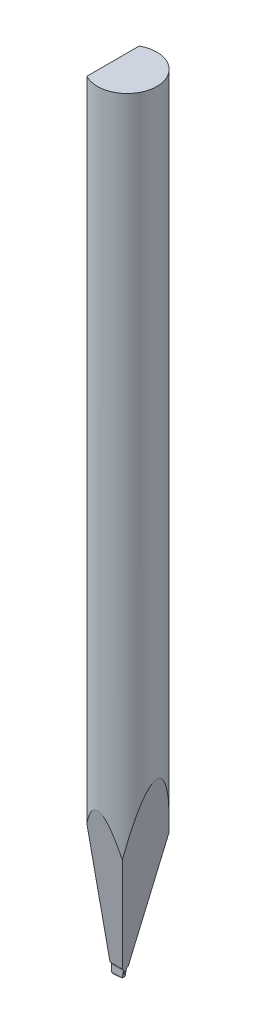
ISO-10303-21;
HEADER;
FILE_DESCRIPTION(('STEP AP214'),'2;1');
FILE_NAME('part.step','',(''),(''),'','','');
FILE_SCHEMA(('AUTOMOTIVE_DESIGN { 1 0 10303 214 1 1 1 1 }'));
ENDSEC;
DATA;
#1=APPLICATION_CONTEXT('core data for automotive mechanical design processes');
#2=APPLICATION_PROTOCOL_DEFINITION('international standard','automotive_design',2000,#1);
#3=PRODUCT_CONTEXT('',#1,'mechanical');
#4=PRODUCT('Part','Part','',(#3));
#5=PRODUCT_RELATED_PRODUCT_CATEGORY('part','',(#4));
#6=PRODUCT_DEFINITION_FORMATION('','',#4);
#7=PRODUCT_DEFINITION_CONTEXT('part definition',#1,'design');
#8=PRODUCT_DEFINITION('design','',#6,#7);
#9=PRODUCT_DEFINITION_SHAPE('','',#8);
#10=(LENGTH_UNIT() NAMED_UNIT(*) SI_UNIT(.MILLI.,.METRE.));
#11=(NAMED_UNIT(*) PLANE_ANGLE_UNIT() SI_UNIT($,.RADIAN.));
#12=(NAMED_UNIT(*) SI_UNIT($,.STERADIAN.) SOLID_ANGLE_UNIT());
#13=UNCERTAINTY_MEASURE_WITH_UNIT(LENGTH_MEASURE(1.E-05),#10,'distance_accuracy_value','');
#14=(GEOMETRIC_REPRESENTATION_CONTEXT(3) GLOBAL_UNCERTAINTY_ASSIGNED_CONTEXT((#13)) GLOBAL_UNIT_ASSIGNED_CONTEXT((#10,
#11,#12)) REPRESENTATION_CONTEXT('',''));
#15=CARTESIAN_POINT('',(0.,0.,0.));
#16=DIRECTION('',(0.,0.,1.));
#17=DIRECTION('',(1.,0.,0.));
#18=AXIS2_PLACEMENT_3D('',#15,#16,#17);
#19=CARTESIAN_POINT('',(-0.2921,0.,26.504781075442));
#20=DIRECTION('',(-0.139173100960066,0.99026806874157,0.));
#21=DIRECTION('',(-0.99026806874157,-0.139173100960066,0.));
#22=AXIS2_PLACEMENT_3D('',#19,#20,#21);
#23=PLANE('',#22);
#24=DIRECTION('',(-0.99026806874157,-0.139173100960066,0.));
#25=VECTOR('',#24,1.);
#26=CARTESIAN_POINT('',(-0.2921,0.,0.0181599839999998));
#27=LINE('',#26,#25);
#28=CARTESIAN_POINT('',(-0.18288,0.0153498699661952,0.0181599839999999));
#29=VERTEX_POINT('',#28);
#30=CARTESIAN_POINT('',(-0.274468050343923,0.00247800892209596,0.018159984));
#31=VERTEX_POINT('',#30);
#32=EDGE_CURVE('E234',#29,#31,#27,.T.);
#33=ORIENTED_EDGE('',*,*,#32,.F.);
#34=DIRECTION('',(0.,0.,1.));
#35=VECTOR('',#34,1.);
#36=CARTESIAN_POINT('',(-0.18288,0.0153498699661952,26.504781075442));
#37=LINE('',#36,#35);
#38=CARTESIAN_POINT('',(-0.18288,0.0153498699661952,-0.0181599839999999));
#39=VERTEX_POINT('',#38);
#40=EDGE_CURVE('E11',#39,#29,#37,.T.);
#41=ORIENTED_EDGE('',*,*,#40,.F.);
#42=DIRECTION('',(-0.99026806874157,-0.139173100960066,0.));
#43=VECTOR('',#42,1.);
#44=CARTESIAN_POINT('',(-0.2921,0.,-0.0181599839999998));
#45=LINE('',#44,#43);
#46=CARTESIAN_POINT('',(-0.274468050343923,0.00247800892209596,-0.018159984));
#47=VERTEX_POINT('',#46);
#48=EDGE_CURVE('E231',#39,#47,#45,.T.);
#49=ORIENTED_EDGE('',*,*,#48,.T.);
#50=CARTESIAN_POINT('',(-1.15056935700565,-0.12065,0.));
#51=DIRECTION('',(-0.139173100960066,0.99026806874157,0.));
#52=DIRECTION('',(-0.99026806874157,-0.139173100960066,0.));
#53=AXIS2_PLACEMENT_3D('',#50,#51,#52);
#54=ELLIPSE('',#53,0.894282006662425,0.12446);
#55=CARTESIAN_POINT('',(-0.2921,0.,-0.0305592719154106));
#56=VERTEX_POINT('',#55);
#57=EDGE_CURVE('E240',#47,#56,#54,.T.);
#58=ORIENTED_EDGE('',*,*,#57,.T.);
#59=DIRECTION('',(0.,0.,-1.));
#60=VECTOR('',#59,1.);
#61=CARTESIAN_POINT('',(-0.2921,0.,26.504781075442));
#62=LINE('',#61,#60);
#63=CARTESIAN_POINT('',(-0.292100000000003,0.,-0.0317499999999999));
#64=VERTEX_POINT('',#63);
#65=EDGE_CURVE('E258',#56,#64,#62,.T.);
#66=ORIENTED_EDGE('',*,*,#65,.T.);
#67=DIRECTION('',(0.98997002855162,0.139131214142995,-0.0245325869121374));
#68=VECTOR('',#67,1.);
#69=CARTESIAN_POINT('',(26.3316570087555,3.74172503292415,-0.691517077696801));
#70=LINE('',#69,#68);
#71=CARTESIAN_POINT('',(-0.09155014577503,0.0281854439122204,-0.0367198542249697));
#72=VERTEX_POINT('',#71);
#73=EDGE_CURVE('E362',#64,#72,#70,.T.);
#74=ORIENTED_EDGE('',*,*,#73,.T.);
#75=DIRECTION('',(0.,0.,-1.));
#76=VECTOR('',#75,1.);
#77=CARTESIAN_POINT('',(-0.0915501457750305,0.0281854439122202,26.504781075442));
#78=LINE('',#77,#76);
#79=CARTESIAN_POINT('',(-0.09155014577503,0.0281854439122204,0.0367198542249697));
#80=VERTEX_POINT('',#79);
#81=EDGE_CURVE('E255',#80,#72,#78,.T.);
#82=ORIENTED_EDGE('',*,*,#81,.F.);
#83=DIRECTION('',(-0.98997002855162,-0.139131214142995,-0.0245325869121374));
#84=VECTOR('',#83,1.);
#85=CARTESIAN_POINT('',(26.3316570087555,3.74172503292415,0.691517077696801));
#86=LINE('',#85,#84);
#87=CARTESIAN_POINT('',(-0.292100000000003,0.,0.0317499999999999));
#88=VERTEX_POINT('',#87);
#89=EDGE_CURVE('E291',#80,#88,#86,.T.);
#90=ORIENTED_EDGE('',*,*,#89,.T.);
#91=CARTESIAN_POINT('',(-0.2921,0.,0.0305592719154106));
#92=VERTEX_POINT('',#91);
#93=EDGE_CURVE('E259',#88,#92,#62,.T.);
#94=ORIENTED_EDGE('',*,*,#93,.T.);
#95=EDGE_CURVE('E242',#92,#31,#54,.T.);
#96=ORIENTED_EDGE('',*,*,#95,.T.);
#97=EDGE_LOOP('',(#33,#41,#49,#58,#66,#74,#82,#90,#94,#96));
#98=FACE_BOUND('',#97,.T.);
#99=ADVANCED_FACE('F43',(#98),#23,.F.);
#100=CARTESIAN_POINT('',(26.8389469491216,-0.12065,0.));
#101=DIRECTION('',(-1.,0.,0.));
#102=DIRECTION('',(0.,0.,1.));
#103=AXIS2_PLACEMENT_3D('',#100,#101,#102);
#104=CYLINDRICAL_SURFACE('',#103,0.12446);
#105=DIRECTION('',(-1.,0.,0.));
#106=VECTOR('',#105,1.);
#107=CARTESIAN_POINT('',(26.8389469491216,0.00247800892209596,0.018159984));
#108=LINE('',#107,#106);
#109=CARTESIAN_POINT('',(-0.303053922822618,0.00247800892209603,0.018159984));
#110=VERTEX_POINT('',#109);
#111=EDGE_CURVE('E51',#31,#110,#108,.T.);
#112=ORIENTED_EDGE('',*,*,#111,.F.);
#113=ORIENTED_EDGE('',*,*,#95,.F.);
#114=DIRECTION('',(-1.,0.,0.));
#115=VECTOR('',#114,1.);
#116=CARTESIAN_POINT('',(26.8389469491216,0.,0.0305592719154106));
#117=LINE('',#116,#115);
#118=CARTESIAN_POINT('',(-0.34798,0.,0.0305592719155763));
#119=VERTEX_POINT('',#118);
#120=EDGE_CURVE('E66',#92,#119,#117,.T.);
#121=ORIENTED_EDGE('',*,*,#120,.T.);
#122=CARTESIAN_POINT('',(-0.34798,0.,-0.0305592719154105));
#123=CARTESIAN_POINT('',(-0.348430814510365,-4.0790157401786E-07,-0.030560581386463));
#124=CARTESIAN_POINT('',(-0.348879913015498,1.08939864350477E-05,-0.0305162789202461));
#125=CARTESIAN_POINT('',(-0.349756979795945,5.32586660468888E-05,-0.0303484247483048));
#126=CARTESIAN_POINT('',(-0.350185131865885,8.40923596505527E-05,-0.0302257916828257));
#127=CARTESIAN_POINT('',(-0.351011762424045,0.000161841460247365,-0.0299134495677672));
#128=CARTESIAN_POINT('',(-0.351410362022562,0.000208686245204474,-0.0297240349657186));
#129=CARTESIAN_POINT('',(-0.352176540220128,0.000314247686217708,-0.0292915141713706));
#130=CARTESIAN_POINT('',(-0.352544019029949,0.000373000623512143,-0.0290482436791118));
#131=CARTESIAN_POINT('',(-0.353492609976714,0.000542464303570054,-0.0283352771344417));
#132=CARTESIAN_POINT('',(-0.354042823136011,0.000660718500816304,-0.0278264292093499));
#133=CARTESIAN_POINT('',(-0.355058485849617,0.000906480045085761,-0.0267326241717132));
#134=CARTESIAN_POINT('',(-0.355523692710971,0.00103401247561593,-0.0261474570746311));
#135=CARTESIAN_POINT('',(-0.356737267127974,0.00139509322037842,-0.024424665265501));
#136=CARTESIAN_POINT('',(-0.357402825120589,0.00162934905892421,-0.0232293596959535));
#137=CARTESIAN_POINT('',(-0.358560754617679,0.00207372872141576,-0.0207553925747807));
#138=CARTESIAN_POINT('',(-0.359052698197646,0.00228379206987497,-0.0194765341415885));
#139=CARTESIAN_POINT('',(-0.36030774701552,0.00284958434009851,-0.0156411550181883));
#140=CARTESIAN_POINT('',(-0.360888602450784,0.00315568845104849,-0.0130178775361172));
#141=CARTESIAN_POINT('',(-0.361706163735848,0.00360035199279706,-0.00770331230592785));
#142=CARTESIAN_POINT('',(-0.361941722221542,0.00373835258818556,-0.00501182791337141));
#143=CARTESIAN_POINT('',(-0.362122159422928,0.00384312710698266,0.000626307070904409));
#144=CARTESIAN_POINT('',(-0.362039043463169,0.00379341669557573,0.00357417277699146));
#145=CARTESIAN_POINT('',(-0.36150170314798,0.00348744188955353,0.00941520395438301));
#146=CARTESIAN_POINT('',(-0.361049465589899,0.0032322834184667,0.0123085776336631));
#147=CARTESIAN_POINT('',(-0.360101881253082,0.00276522394071858,0.0161243719322801));
#148=CARTESIAN_POINT('',(-0.359823561043634,0.00263206670724784,0.0171113029227183));
#149=CARTESIAN_POINT('',(-0.359191091592352,0.00234550293161942,0.0190622381461741));
#150=CARTESIAN_POINT('',(-0.358836664817193,0.00219202308727775,0.0200261437209395));
#151=CARTESIAN_POINT('',(-0.35792019094462,0.00182196264863964,0.0221910750494741));
#152=CARTESIAN_POINT('',(-0.35732773854375,0.00160009037378041,0.0233785738678838));
#153=CARTESIAN_POINT('',(-0.355941185679961,0.00114822728257018,0.0256274014231926));
#154=CARTESIAN_POINT('',(-0.35514861217987,0.000918308819136108,0.0266895999907303));
#155=CARTESIAN_POINT('',(-0.353869594547934,0.000625501592054897,0.027976474269296));
#156=CARTESIAN_POINT('',(-0.353498623594593,0.000547541257563668,0.0283116735867265));
#157=CARTESIAN_POINT('',(-0.352713845163361,0.000401035258663639,0.0289316105181223));
#158=CARTESIAN_POINT('',(-0.352300015965373,0.000332494409296592,0.0292163223453788));
#159=CARTESIAN_POINT('',(-0.35142414885153,0.000209524327572587,0.0297209697927657));
#160=CARTESIAN_POINT('',(-0.350961529273433,0.000155300800887052,0.0299399667559707));
#161=CARTESIAN_POINT('',(-0.350001496573154,6.91140443385488E-05,0.030285638001186));
#162=CARTESIAN_POINT('',(-0.349504228801302,3.70633361955864E-05,0.0304126751846489));
#163=CARTESIAN_POINT('',(-0.348830789757912,1.24370193427594E-05,0.0305101337557273));
#164=CARTESIAN_POINT('',(-0.348661251457123,7.78649892713723E-06,0.0305285162109277));
#165=CARTESIAN_POINT('',(-0.348321176485651,1.56788977353475E-06,0.0305530840375707));
#166=CARTESIAN_POINT('',(-0.348150639475355,9.18970805127776E-10,0.0305592649853819));
#167=CARTESIAN_POINT('',(-0.347980000000024,0.,0.0305592719155779));
#168=B_SPLINE_CURVE_WITH_KNOTS('',3,(#122,#123,#124,#125,#126,#127,#128,#129,#130,#131,#132,
#133,#134,#135,#136,#137,#138,#139,#140,#141,#142,#143,#144,#145,#146,#147,#148,#149,#150,#151,
#152,#153,#154,#155,#156,#157,#158,#159,#160,#161,#162,#163,#164,#165,#166,#167),.UNSPECIFIED.,
.F.,.F.,(4,2,2,2,2,2,2,2,2,2,2,2,2,2,2,2,2,2,2,2,2,2,4),(0.,0.00134741004079565,
0.00267930111383719,0.00400539168870872,0.00533558497102969,0.00759858100656418,
0.00986794025135302,0.0140085166125864,0.0181592285296514,0.0262271883927134,0.0343218964425103,
0.0431433167180924,0.0519175663828487,0.0550173321670425,0.0581285996977776,0.0621538633051677,
0.0661492954960546,0.0676639727026794,0.0691794213229861,0.0707155853403851,0.0722456536356855,
0.0727570681004673,0.0732686679434896),.UNSPECIFIED.);
#169=CARTESIAN_POINT('',(-0.347980000000001,0.,-0.0305592719154106));
#170=VERTEX_POINT('',#169);
#171=EDGE_CURVE('E368',#170,#119,#168,.T.);
#172=ORIENTED_EDGE('',*,*,#171,.F.);
#173=DIRECTION('',(-1.,0.,0.));
#174=VECTOR('',#173,1.);
#175=CARTESIAN_POINT('',(26.8389469491216,0.,-0.0305592719154106));
#176=LINE('',#175,#174);
#177=EDGE_CURVE('E237',#56,#170,#176,.T.);
#178=ORIENTED_EDGE('',*,*,#177,.F.);
#179=ORIENTED_EDGE('',*,*,#57,.F.);
#180=DIRECTION('',(-1.,0.,0.));
#181=VECTOR('',#180,1.);
#182=CARTESIAN_POINT('',(26.8389469491216,0.00247800892209596,-0.018159984));
#183=LINE('',#182,#181);
#184=CARTESIAN_POINT('',(-0.303053922822618,0.00247800892209594,-0.018159984));
#185=VERTEX_POINT('',#184);
#186=EDGE_CURVE('E376',#47,#185,#183,.T.);
#187=ORIENTED_EDGE('',*,*,#186,.T.);
#188=CARTESIAN_POINT('',(-0.303053922822618,0.00247800892209512,-0.018159984));
#189=CARTESIAN_POINT('',(-0.3045906612878,0.00247693714049618,-0.0181602525641606));
#190=CARTESIAN_POINT('',(-0.306132876365614,0.00249629904796934,-0.0180354354389405));
#191=CARTESIAN_POINT('',(-0.309179140238667,0.00257142172638432,-0.0175189374418892));
#192=CARTESIAN_POINT('',(-0.31068293000568,0.00262738371908034,-0.0171257807556235));
#193=CARTESIAN_POINT('',(-0.313245608962042,0.00275433849341226,-0.0161806875618047));
#194=CARTESIAN_POINT('',(-0.31432630611079,0.00281875662564772,-0.0156873765880783));
#195=CARTESIAN_POINT('',(-0.316390331389258,0.00296017039367733,-0.0145313296991762));
#196=CARTESIAN_POINT('',(-0.317373860211467,0.00303713919649623,-0.0138689535689619));
#197=CARTESIAN_POINT('',(-0.319214531849014,0.00319590436262494,-0.012371449314327));
#198=CARTESIAN_POINT('',(-0.320070517025132,0.00327773650087943,-0.0115348867894818));
#199=CARTESIAN_POINT('',(-0.321601622722994,0.0034341488823938,-0.00970825626020926));
#200=CARTESIAN_POINT('',(-0.322276830718142,0.00350873262179676,-0.00871826286448745));
#201=CARTESIAN_POINT('',(-0.323325611029345,0.00362933137019164,-0.0067645154602437));
#202=CARTESIAN_POINT('',(-0.323728159033177,0.00367788284651137,-0.00581644901170145));
#203=CARTESIAN_POINT('',(-0.324347556072474,0.00375393385863425,-0.00386083191258069));
#204=CARTESIAN_POINT('',(-0.324564565020067,0.00378145152085746,-0.00285333328767041));
#205=CARTESIAN_POINT('',(-0.324788380860613,0.00380989202283194,-0.000925161854149006));
#206=CARTESIAN_POINT('',(-0.324815291349069,0.00381335766168345,-6.80983895378196E-06));
#207=CARTESIAN_POINT('',(-0.324710864939121,0.00380003436269531,0.00182055496828357));
#208=CARTESIAN_POINT('',(-0.324579569845757,0.00378325077561139,0.00272957016353164));
#209=CARTESIAN_POINT('',(-0.324170704662592,0.00373215033810067,0.00448590840393145));
#210=CARTESIAN_POINT('',(-0.323897410718322,0.00369834689795863,0.00533425137039063));
#211=CARTESIAN_POINT('',(-0.323218440288682,0.00361710302962213,0.00697527574370233));
#212=CARTESIAN_POINT('',(-0.322812750921428,0.00356966127449275,0.00776795172511362));
#213=CARTESIAN_POINT('',(-0.321865110886678,0.00346369688961824,0.00931158779187664));
#214=CARTESIAN_POINT('',(-0.321318242358268,0.00340479877853084,0.0100594914324234));
#215=CARTESIAN_POINT('',(-0.320117351130312,0.00328300771365445,0.011462920896783));
#216=CARTESIAN_POINT('',(-0.319463295031723,0.00322011351846027,0.0121184178083755));
#217=CARTESIAN_POINT('',(-0.31799800710592,0.00308941922609576,0.0133902010292913));
#218=CARTESIAN_POINT('',(-0.317177577870765,0.00302176357428023,0.0139958765156066));
#219=CARTESIAN_POINT('',(-0.31545724003934,0.00289404162350408,0.0150818135833673));
#220=CARTESIAN_POINT('',(-0.314557287937132,0.00283397952310053,0.0155620059390116));
#221=CARTESIAN_POINT('',(-0.312561571075008,0.00271768655803021,0.0164602566536829));
#222=CARTESIAN_POINT('',(-0.311456669445485,0.00266337767608398,0.0168582292779863));
#223=CARTESIAN_POINT('',(-0.309201755579546,0.00257473154352286,0.0174947488489722));
#224=CARTESIAN_POINT('',(-0.308051728939537,0.00254040072604145,0.0177332444461628));
#225=CARTESIAN_POINT('',(-0.305620053170687,0.00249078808312564,0.0180732840829719));
#226=CARTESIAN_POINT('',(-0.304336216078334,0.00247760709659169,0.0181597982416978));
#227=CARTESIAN_POINT('',(-0.303053922822736,0.00247800892198128,0.0181599840008256));
#228=B_SPLINE_CURVE_WITH_KNOTS('',3,(#188,#189,#190,#191,#192,#193,#194,#195,#196,#197,#198,
#199,#200,#201,#202,#203,#204,#205,#206,#207,#208,#209,#210,#211,#212,#213,#214,#215,#216,#217,
#218,#219,#220,#221,#222,#223,#224,#225,#226,#227),.UNSPECIFIED.,.F.,.F.,(4,2,2,2,2,2,2,2,2,2,2,
2,2,2,2,2,2,2,2,4),(0.,0.004614059633907,0.00925370236385515,0.012808435378078,
0.0163556657901881,0.0199333523219159,0.02350930456206,0.0265852337117854,0.0296585091040677,
0.0324011314176554,0.0351430291658446,0.0378067709929865,0.0404707720756876,0.0432443365054099,
0.046018766811138,0.0490728293514968,0.0521285731992222,0.0556421049496487,0.0591567674667326,
0.0630027569689262),.UNSPECIFIED.);
#229=EDGE_CURVE('E391',#185,#110,#228,.T.);
#230=ORIENTED_EDGE('',*,*,#229,.T.);
#231=EDGE_LOOP('',(#112,#113,#121,#172,#178,#179,#187,#230));
#232=FACE_BOUND('',#231,.T.);
#233=ADVANCED_FACE('F381',(#232),#104,.F.);
#234=CARTESIAN_POINT('',(0.,0.,0.));
#235=DIRECTION('',(0.,1.,0.));
#236=DIRECTION('',(0.,0.,1.));
#237=AXIS2_PLACEMENT_3D('',#234,#235,#236);
#238=PLANE('',#237);
#239=ORIENTED_EDGE('',*,*,#120,.F.);
#240=ORIENTED_EDGE('',*,*,#93,.F.);
#241=DIRECTION('',(-1.,0.,0.));
#242=VECTOR('',#241,1.);
#243=CARTESIAN_POINT('',(26.8738719491216,0.,0.03175));
#244=LINE('',#243,#242);
#245=CARTESIAN_POINT('',(-0.34798,0.,0.0317500000000012));
#246=VERTEX_POINT('',#245);
#247=EDGE_CURVE('E314',#88,#246,#244,.T.);
#248=ORIENTED_EDGE('',*,*,#247,.T.);
#249=DIRECTION('',(0.,0.,-1.));
#250=VECTOR('',#249,1.);
#251=CARTESIAN_POINT('',(-0.34798,0.,26.4436594491216));
#252=LINE('',#251,#250);
#253=EDGE_CURVE('E246',#246,#119,#252,.T.);
#254=ORIENTED_EDGE('',*,*,#253,.T.);
#255=EDGE_LOOP('',(#239,#240,#248,#254));
#256=FACE_BOUND('',#255,.T.);
#257=ADVANCED_FACE('F385',(#256),#238,.F.);
#258=CARTESIAN_POINT('',(26.8738719491216,0.,0.03175));
#259=DIRECTION('',(0.,-0.173648177666931,0.984807753012208));
#260=DIRECTION('',(0.,-0.984807753012208,-0.173648177666931));
#261=AXIS2_PLACEMENT_3D('',#258,#259,#260);
#262=PLANE('',#261);
#263=CARTESIAN_POINT('',(-0.34798,0.02794,0.0366765758409958));
#264=DIRECTION('',(0.,-0.173648177666931,0.984807753012208));
#265=DIRECTION('',(0.,-0.984807753012208,-0.173648177666931));
#266=AXIS2_PLACEMENT_3D('',#263,#264,#265);
#267=ELLIPSE('',#266,0.0283710195360877,0.02794);
#268=CARTESIAN_POINT('',(-0.37592,0.02794,0.0366765758409958));
#269=VERTEX_POINT('',#268);
#270=EDGE_CURVE('E249',#246,#269,#267,.F.);
#271=ORIENTED_EDGE('',*,*,#270,.F.);
#272=ORIENTED_EDGE('',*,*,#247,.F.);
#273=ORIENTED_EDGE('',*,*,#89,.F.);
#274=DIRECTION('',(-0.171087869746036,-0.970287525247814,-0.171087869746036));
#275=VECTOR('',#274,1.);
#276=CARTESIAN_POINT('',(0.692931938695091,4.47720442738341,0.821201938695093));
#277=LINE('',#276,#275);
#278=CARTESIAN_POINT('',(-0.0901699999999961,0.036012639554572,0.0381));
#279=VERTEX_POINT('',#278);
#280=EDGE_CURVE('E276',#279,#80,#277,.T.);
#281=ORIENTED_EDGE('',*,*,#280,.F.);
#282=DIRECTION('',(-1.,0.,0.));
#283=VECTOR('',#282,1.);
#284=CARTESIAN_POINT('',(26.8738719491216,0.0360126395545722,0.0381));
#285=LINE('',#284,#283);
#286=CARTESIAN_POINT('',(-0.375919999999998,0.0360126395545722,0.0381));
#287=VERTEX_POINT('',#286);
#288=EDGE_CURVE('E350',#279,#287,#285,.T.);
#289=ORIENTED_EDGE('',*,*,#288,.T.);
#290=DIRECTION('',(0.,0.984807753012208,0.173648177666931));
#291=VECTOR('',#290,1.);
#292=CARTESIAN_POINT('',(-0.37592,20.2126435335673,3.59578440641042));
#293=LINE('',#292,#291);
#294=EDGE_CURVE('E336',#269,#287,#293,.T.);
#295=ORIENTED_EDGE('',*,*,#294,.F.);
#296=EDGE_LOOP('',(#271,#272,#273,#281,#289,#295));
#297=FACE_BOUND('',#296,.T.);
#298=ADVANCED_FACE('F464',(#297),#262,.T.);
#299=CARTESIAN_POINT('',(26.8738719491216,0.,-0.03175));
#300=DIRECTION('',(0.,-0.173648177666931,-0.984807753012208));
#301=DIRECTION('',(0.,0.984807753012208,-0.173648177666931));
#302=AXIS2_PLACEMENT_3D('',#299,#300,#301);
#303=PLANE('',#302);
#304=CARTESIAN_POINT('',(-0.34798,0.02794,-0.0366765758409958));
#305=DIRECTION('',(0.,-0.173648177666931,-0.984807753012208));
#306=DIRECTION('',(0.,0.984807753012208,-0.173648177666931));
#307=AXIS2_PLACEMENT_3D('',#304,#305,#306);
#308=ELLIPSE('',#307,0.0283710195360877,0.02794);
#309=CARTESIAN_POINT('',(-0.37592,0.02794,-0.0366765758409958));
#310=VERTEX_POINT('',#309);
#311=CARTESIAN_POINT('',(-0.34798,0.,-0.0317500000000005));
#312=VERTEX_POINT('',#311);
#313=EDGE_CURVE('E365',#310,#312,#308,.F.);
#314=ORIENTED_EDGE('',*,*,#313,.F.);
#315=DIRECTION('',(0.,-0.984807753012208,0.173648177666931));
#316=VECTOR('',#315,1.);
#317=CARTESIAN_POINT('',(-0.37592,20.5705607731547,-3.65889487261038));
#318=LINE('',#317,#316);
#319=CARTESIAN_POINT('',(-0.375919999999998,0.0360126395545722,-0.0381));
#320=VERTEX_POINT('',#319);
#321=EDGE_CURVE('E338',#320,#310,#318,.T.);
#322=ORIENTED_EDGE('',*,*,#321,.F.);
#323=DIRECTION('',(1.,0.,0.));
#324=VECTOR('',#323,1.);
#325=CARTESIAN_POINT('',(26.8738719491216,0.0360126395545722,-0.0381));
#326=LINE('',#325,#324);
#327=CARTESIAN_POINT('',(-0.0901699999999961,0.036012639554572,-0.0381));
#328=VERTEX_POINT('',#327);
#329=EDGE_CURVE('E342',#320,#328,#326,.T.);
#330=ORIENTED_EDGE('',*,*,#329,.T.);
#331=DIRECTION('',(0.171087869746036,0.970287525247814,-0.171087869746036));
#332=VECTOR('',#331,1.);
#333=CARTESIAN_POINT('',(0.692931938695091,4.47720442738341,-0.821201938695093));
#334=LINE('',#333,#332);
#335=EDGE_CURVE('E288',#72,#328,#334,.T.);
#336=ORIENTED_EDGE('',*,*,#335,.F.);
#337=ORIENTED_EDGE('',*,*,#73,.F.);
#338=DIRECTION('',(-1.,0.,0.));
#339=VECTOR('',#338,1.);
#340=CARTESIAN_POINT('',(26.8738719491216,0.,-0.03175));
#341=LINE('',#340,#339);
#342=EDGE_CURVE('E317',#64,#312,#341,.T.);
#343=ORIENTED_EDGE('',*,*,#342,.T.);
#344=EDGE_LOOP('',(#314,#322,#330,#336,#337,#343));
#345=FACE_BOUND('',#344,.T.);
#346=ADVANCED_FACE('F414',(#345),#303,.T.);
#347=ORIENTED_EDGE('',*,*,#65,.F.);
#348=ORIENTED_EDGE('',*,*,#177,.T.);
#349=EDGE_CURVE('E250',#170,#312,#252,.T.);
#350=ORIENTED_EDGE('',*,*,#349,.T.);
#351=ORIENTED_EDGE('',*,*,#342,.F.);
#352=EDGE_LOOP('',(#347,#348,#350,#351));
#353=FACE_BOUND('',#352,.T.);
#354=ADVANCED_FACE('F416',(#353),#238,.F.);
#355=CARTESIAN_POINT('',(0.,21.0312,0.));
#356=DIRECTION('',(0.,-1.,0.));
#357=DIRECTION('',(0.,0.,-1.));
#358=AXIS2_PLACEMENT_3D('',#355,#356,#357);
#359=CYLINDRICAL_SURFACE('',#358,0.792479999999998);
#360=CARTESIAN_POINT('',(0.,-0.180063197772862,0.));
#361=DIRECTION('',(0.,-0.173648177666931,0.984807753012208));
#362=DIRECTION('',(0.,-0.984807753012208,-0.173648177666931));
#363=AXIS2_PLACEMENT_3D('',#360,#361,#362);
#364=ELLIPSE('',#363,4.56371043248163,0.792479999999998);
#365=CARTESIAN_POINT('',(0.492550707536127,3.34078599411896,0.620820707536128));
#366=VERTEX_POINT('',#365);
#367=CARTESIAN_POINT('',(-0.37592,3.77647884937786,0.69764511322018));
#368=VERTEX_POINT('',#367);
#369=EDGE_CURVE('E320',#366,#368,#364,.T.);
#370=ORIENTED_EDGE('',*,*,#369,.F.);
#371=CARTESIAN_POINT('',(0.,0.547392121229499,0.));
#372=DIRECTION('',(-0.984807753012208,0.173648177666931,0.));
#373=DIRECTION('',(-0.173648177666931,-0.984807753012208,0.));
#374=AXIS2_PLACEMENT_3D('',#371,#372,#373);
#375=ELLIPSE('',#374,4.56371043248165,0.792479999999998);
#376=CARTESIAN_POINT('',(0.492550707536127,3.34078599411896,-0.620820707536128));
#377=VERTEX_POINT('',#376);
#378=EDGE_CURVE('E268',#366,#377,#375,.T.);
#379=ORIENTED_EDGE('',*,*,#378,.T.);
#380=CARTESIAN_POINT('',(0.,-0.180063197772862,0.));
#381=DIRECTION('',(0.,-0.173648177666931,-0.984807753012208));
#382=DIRECTION('',(0.,-0.984807753012208,0.173648177666931));
#383=AXIS2_PLACEMENT_3D('',#380,#381,#382);
#384=ELLIPSE('',#383,4.56371043248163,0.792479999999998);
#385=CARTESIAN_POINT('',(-0.37592,3.77647884937786,-0.69764511322018));
#386=VERTEX_POINT('',#385);
#387=EDGE_CURVE('E322',#386,#377,#384,.T.);
#388=ORIENTED_EDGE('',*,*,#387,.F.);
#389=DIRECTION('',(0.,-1.,0.));
#390=VECTOR('',#389,1.);
#391=CARTESIAN_POINT('',(-0.37592,21.0312,-0.69764511322018));
#392=LINE('',#391,#390);
#393=CARTESIAN_POINT('',(-0.37592,21.0312,-0.69764511322018));
#394=VERTEX_POINT('',#393);
#395=EDGE_CURVE('E329',#394,#386,#392,.T.);
#396=ORIENTED_EDGE('',*,*,#395,.F.);
#397=CARTESIAN_POINT('',(0.,21.0312,0.));
#398=DIRECTION('',(0.,1.,0.));
#399=DIRECTION('',(0.,0.,1.));
#400=AXIS2_PLACEMENT_3D('',#397,#398,#399);
#401=CIRCLE('',#400,0.792479999999998);
#402=CARTESIAN_POINT('',(-0.37592,21.0312,0.69764511322018));
#403=VERTEX_POINT('',#402);
#404=EDGE_CURVE('E332',#403,#394,#401,.T.);
#405=ORIENTED_EDGE('',*,*,#404,.F.);
#406=DIRECTION('',(0.,-1.,0.));
#407=VECTOR('',#406,1.);
#408=CARTESIAN_POINT('',(-0.37592,21.0312,0.69764511322018));
#409=LINE('',#408,#407);
#410=EDGE_CURVE('E327',#368,#403,#409,.F.);
#411=ORIENTED_EDGE('',*,*,#410,.F.);
#412=EDGE_LOOP('',(#370,#379,#388,#396,#405,#411));
#413=FACE_BOUND('',#412,.T.);
#414=ADVANCED_FACE('F45',(#413),#359,.T.);
#415=CARTESIAN_POINT('',(-0.37592,21.0312,-1.04648));
#416=DIRECTION('',(-1.,0.,0.));
#417=DIRECTION('',(0.,0.,1.));
#418=AXIS2_PLACEMENT_3D('',#415,#416,#417);
#419=PLANE('',#418);
#420=DIRECTION('',(0.,0.,-1.));
#421=VECTOR('',#420,1.);
#422=CARTESIAN_POINT('',(-0.37592,0.02794,26.4436594491216));
#423=LINE('',#422,#421);
#424=EDGE_CURVE('E245',#269,#310,#423,.T.);
#425=ORIENTED_EDGE('',*,*,#424,.F.);
#426=ORIENTED_EDGE('',*,*,#294,.T.);
#427=DIRECTION('',(0.,1.,0.));
#428=VECTOR('',#427,1.);
#429=CARTESIAN_POINT('',(-0.37592,21.0312,0.0380999999999999));
#430=LINE('',#429,#428);
#431=CARTESIAN_POINT('',(-0.375919999999998,0.2032,0.0381));
#432=VERTEX_POINT('',#431);
#433=EDGE_CURVE('E311',#287,#432,#430,.T.);
#434=ORIENTED_EDGE('',*,*,#433,.T.);
#435=CARTESIAN_POINT('',(-0.375919999999998,0.2032,0.1143));
#436=DIRECTION('',(-1.,0.,0.));
#437=DIRECTION('',(0.,0.,1.));
#438=AXIS2_PLACEMENT_3D('',#435,#436,#437);
#439=CIRCLE('',#438,0.0762);
#440=CARTESIAN_POINT('',(-0.375919999999998,0.257081536726415,0.0604184632735852));
#441=VERTEX_POINT('',#440);
#442=EDGE_CURVE('E353',#432,#441,#439,.F.);
#443=ORIENTED_EDGE('',*,*,#442,.T.);
#444=DIRECTION('',(0.,0.707106781186546,0.707106781186549));
#445=VECTOR('',#444,1.);
#446=CARTESIAN_POINT('',(-0.37592,10.0906915367264,9.89402846327358));
#447=LINE('',#446,#445);
#448=CARTESIAN_POINT('',(-0.375919999999998,0.277310374509165,0.080647301056335));
#449=VERTEX_POINT('',#448);
#450=EDGE_CURVE('E308',#441,#449,#447,.T.);
#451=ORIENTED_EDGE('',*,*,#450,.T.);
#452=EDGE_CURVE('E335',#449,#368,#293,.T.);
#453=ORIENTED_EDGE('',*,*,#452,.T.);
#454=ORIENTED_EDGE('',*,*,#410,.T.);
#455=DIRECTION('',(0.,0.,-1.));
#456=VECTOR('',#455,1.);
#457=CARTESIAN_POINT('',(-0.37592,21.0312,-1.04648));
#458=LINE('',#457,#456);
#459=EDGE_CURVE('E325',#403,#394,#458,.T.);
#460=ORIENTED_EDGE('',*,*,#459,.T.);
#461=ORIENTED_EDGE('',*,*,#395,.T.);
#462=CARTESIAN_POINT('',(-0.375919999999998,0.277310374509165,-0.080647301056335));
#463=VERTEX_POINT('',#462);
#464=EDGE_CURVE('E339',#386,#463,#318,.T.);
#465=ORIENTED_EDGE('',*,*,#464,.T.);
#466=DIRECTION('',(0.,-0.707106781186546,0.707106781186549));
#467=VECTOR('',#466,1.);
#468=CARTESIAN_POINT('',(-0.37592,11.1371715367264,-10.9405084632736));
#469=LINE('',#468,#467);
#470=CARTESIAN_POINT('',(-0.375919999999998,0.257081536726415,-0.0604184632735852));
#471=VERTEX_POINT('',#470);
#472=EDGE_CURVE('E305',#463,#471,#469,.T.);
#473=ORIENTED_EDGE('',*,*,#472,.T.);
#474=CARTESIAN_POINT('',(-0.375919999999998,0.2032,-0.1143));
#475=DIRECTION('',(-1.,0.,0.));
#476=DIRECTION('',(0.,0.,1.));
#477=AXIS2_PLACEMENT_3D('',#474,#475,#476);
#478=CIRCLE('',#477,0.0762);
#479=CARTESIAN_POINT('',(-0.375919999999998,0.2032,-0.0381));
#480=VERTEX_POINT('',#479);
#481=EDGE_CURVE('E356',#471,#480,#478,.F.);
#482=ORIENTED_EDGE('',*,*,#481,.T.);
#483=DIRECTION('',(0.,-1.,0.));
#484=VECTOR('',#483,1.);
#485=CARTESIAN_POINT('',(-0.37592,21.0312,-0.0380999999999999));
#486=LINE('',#485,#484);
#487=EDGE_CURVE('E302',#480,#320,#486,.T.);
#488=ORIENTED_EDGE('',*,*,#487,.T.);
#489=ORIENTED_EDGE('',*,*,#321,.T.);
#490=EDGE_LOOP('',(#425,#426,#434,#443,#451,#453,#454,#460,#461,#465,#473,#482,#488,#489));
#491=FACE_BOUND('',#490,.T.);
#492=ADVANCED_FACE('F424',(#491),#419,.T.);
#493=DIRECTION('',(-0.171087869746036,-0.970287525247814,-0.171087869746036));
#494=VECTOR('',#493,1.);
#495=CARTESIAN_POINT('',(0.692931938695091,4.47720442738341,0.821201938695093));
#496=LINE('',#495,#494);
#497=CARTESIAN_POINT('',(-0.0476226989436646,0.277310374509165,0.0806473010563347));
#498=VERTEX_POINT('',#497);
#499=EDGE_CURVE('E265',#366,#498,#496,.T.);
#500=ORIENTED_EDGE('',*,*,#499,.F.);
#501=ORIENTED_EDGE('',*,*,#369,.T.);
#502=ORIENTED_EDGE('',*,*,#452,.F.);
#503=DIRECTION('',(1.,0.,0.));
#504=VECTOR('',#503,1.);
#505=CARTESIAN_POINT('',(26.8738719491216,0.277310374509165,0.080647301056335));
#506=LINE('',#505,#504);
#507=EDGE_CURVE('E347',#449,#498,#506,.T.);
#508=ORIENTED_EDGE('',*,*,#507,.T.);
#509=EDGE_LOOP('',(#500,#501,#502,#508));
#510=FACE_BOUND('',#509,.T.);
#511=ADVANCED_FACE('F450',(#510),#262,.T.);
#512=DIRECTION('',(0.171087869746036,0.970287525247814,-0.171087869746036));
#513=VECTOR('',#512,1.);
#514=CARTESIAN_POINT('',(0.692931938695091,4.47720442738341,-0.821201938695093));
#515=LINE('',#514,#513);
#516=CARTESIAN_POINT('',(-0.0476226989436646,0.277310374509165,-0.0806473010563347));
#517=VERTEX_POINT('',#516);
#518=EDGE_CURVE('E273',#517,#377,#515,.T.);
#519=ORIENTED_EDGE('',*,*,#518,.F.);
#520=DIRECTION('',(-1.,0.,0.));
#521=VECTOR('',#520,1.);
#522=CARTESIAN_POINT('',(26.8738719491216,0.277310374509165,-0.080647301056335));
#523=LINE('',#522,#521);
#524=EDGE_CURVE('E345',#517,#463,#523,.T.);
#525=ORIENTED_EDGE('',*,*,#524,.T.);
#526=ORIENTED_EDGE('',*,*,#464,.F.);
#527=ORIENTED_EDGE('',*,*,#387,.T.);
#528=EDGE_LOOP('',(#519,#525,#526,#527));
#529=FACE_BOUND('',#528,.T.);
#530=ADVANCED_FACE('F439',(#529),#303,.T.);
#531=CARTESIAN_POINT('',(0.,21.0312,0.));
#532=DIRECTION('',(0.,1.,0.));
#533=DIRECTION('',(0.,0.,1.));
#534=AXIS2_PLACEMENT_3D('',#531,#532,#533);
#535=PLANE('',#534);
#536=ORIENTED_EDGE('',*,*,#404,.T.);
#537=ORIENTED_EDGE('',*,*,#459,.F.);
#538=EDGE_LOOP('',(#536,#537));
#539=FACE_BOUND('',#538,.T.);
#540=ADVANCED_FACE('F505',(#539),#535,.T.);
#541=CARTESIAN_POINT('',(26.8738719491216,0.,-0.0381));
#542=DIRECTION('',(0.,0.,-1.));
#543=DIRECTION('',(-1.,0.,0.));
#544=AXIS2_PLACEMENT_3D('',#541,#542,#543);
#545=PLANE('',#544);
#546=DIRECTION('',(0.173648177666931,0.984807753012208,0.));
#547=VECTOR('',#546,1.);
#548=CARTESIAN_POINT('',(0.716736827414185,4.61220865999402,-0.0381));
#549=LINE('',#548,#547);
#550=CARTESIAN_POINT('',(-0.06069035752004,0.2032,-0.0381));
#551=VERTEX_POINT('',#550);
#552=EDGE_CURVE('E285',#328,#551,#549,.T.);
#553=ORIENTED_EDGE('',*,*,#552,.F.);
#554=ORIENTED_EDGE('',*,*,#329,.F.);
#555=ORIENTED_EDGE('',*,*,#487,.F.);
#556=DIRECTION('',(-1.,0.,0.));
#557=VECTOR('',#556,1.);
#558=CARTESIAN_POINT('',(26.8738719491216,0.2032,-0.0381));
#559=LINE('',#558,#557);
#560=EDGE_CURVE('E298',#551,#480,#559,.T.);
#561=ORIENTED_EDGE('',*,*,#560,.F.);
#562=EDGE_LOOP('',(#553,#554,#555,#561));
#563=FACE_BOUND('',#562,.T.);
#564=ADVANCED_FACE('F430',(#563),#545,.T.);
#565=CARTESIAN_POINT('',(26.8738719491216,0.257081536726415,-0.0604184632735852));
#566=DIRECTION('',(0.,-0.707106781186549,-0.707106781186546));
#567=DIRECTION('',(0.,0.707106781186546,-0.707106781186549));
#568=AXIS2_PLACEMENT_3D('',#565,#566,#567);
#569=PLANE('',#568);
#570=DIRECTION('',(0.123724030206484,0.701673843159862,-0.701673843159865));
#571=VECTOR('',#570,1.);
#572=CARTESIAN_POINT('',(0.360969443058103,2.59455156108245,-2.39788848762963));
#573=LINE('',#572,#571);
#574=CARTESIAN_POINT('',(-0.0511895888331386,0.257081536726415,-0.0604184632735852));
#575=VERTEX_POINT('',#574);
#576=EDGE_CURVE('E279',#575,#517,#573,.T.);
#577=ORIENTED_EDGE('',*,*,#576,.F.);
#578=DIRECTION('',(-1.,0.,0.));
#579=VECTOR('',#578,1.);
#580=CARTESIAN_POINT('',(26.8738719491216,0.257081536726415,-0.0604184632735852));
#581=LINE('',#580,#579);
#582=EDGE_CURVE('E300',#575,#471,#581,.T.);
#583=ORIENTED_EDGE('',*,*,#582,.T.);
#584=ORIENTED_EDGE('',*,*,#472,.F.);
#585=ORIENTED_EDGE('',*,*,#524,.F.);
#586=EDGE_LOOP('',(#577,#583,#584,#585));
#587=FACE_BOUND('',#586,.T.);
#588=ADVANCED_FACE('F436',(#587),#569,.T.);
#589=CARTESIAN_POINT('',(26.8738719491216,0.2032,-0.1143));
#590=DIRECTION('',(-1.,0.,0.));
#591=DIRECTION('',(0.,0.,1.));
#592=AXIS2_PLACEMENT_3D('',#589,#590,#591);
#593=CYLINDRICAL_SURFACE('',#592,0.0762);
#594=CARTESIAN_POINT('',(-0.06069035752004,0.2032,-0.1143));
#595=DIRECTION('',(-0.984807753012208,0.173648177666931,0.));
#596=DIRECTION('',(-0.173648177666931,-0.984807753012208,0.));
#597=AXIS2_PLACEMENT_3D('',#594,#595,#596);
#598=ELLIPSE('',#597,0.0773755078256938,0.0762);
#599=EDGE_CURVE('E282',#551,#575,#598,.T.);
#600=ORIENTED_EDGE('',*,*,#599,.F.);
#601=ORIENTED_EDGE('',*,*,#560,.T.);
#602=ORIENTED_EDGE('',*,*,#481,.F.);
#603=ORIENTED_EDGE('',*,*,#582,.F.);
#604=EDGE_LOOP('',(#600,#601,#602,#603));
#605=FACE_BOUND('',#604,.T.);
#606=ADVANCED_FACE('F433',(#605),#593,.F.);
#607=CARTESIAN_POINT('',(26.8738719491216,0.2032,0.1143));
#608=DIRECTION('',(-1.,0.,0.));
#609=DIRECTION('',(0.,0.,1.));
#610=AXIS2_PLACEMENT_3D('',#607,#608,#609);
#611=CYLINDRICAL_SURFACE('',#610,0.0762);
#612=CARTESIAN_POINT('',(-0.06069035752004,0.2032,0.1143));
#613=DIRECTION('',(-0.984807753012208,0.173648177666931,0.));
#614=DIRECTION('',(-0.173648177666931,-0.984807753012208,0.));
#615=AXIS2_PLACEMENT_3D('',#612,#613,#614);
#616=ELLIPSE('',#615,0.0773755078256938,0.0762);
#617=CARTESIAN_POINT('',(-0.0511895888331388,0.257081536726415,0.0604184632735853));
#618=VERTEX_POINT('',#617);
#619=CARTESIAN_POINT('',(-0.060690357520034,0.2032,0.0381));
#620=VERTEX_POINT('',#619);
#621=EDGE_CURVE('E262',#618,#620,#616,.T.);
#622=ORIENTED_EDGE('',*,*,#621,.F.);
#623=DIRECTION('',(-1.,0.,0.));
#624=VECTOR('',#623,1.);
#625=CARTESIAN_POINT('',(26.8738719491216,0.257081536726415,0.0604184632735852));
#626=LINE('',#625,#624);
#627=EDGE_CURVE('E294',#618,#441,#626,.T.);
#628=ORIENTED_EDGE('',*,*,#627,.T.);
#629=ORIENTED_EDGE('',*,*,#442,.F.);
#630=DIRECTION('',(-1.,0.,0.));
#631=VECTOR('',#630,1.);
#632=CARTESIAN_POINT('',(26.8738719491216,0.2032,0.0381));
#633=LINE('',#632,#631);
#634=EDGE_CURVE('E296',#620,#432,#633,.T.);
#635=ORIENTED_EDGE('',*,*,#634,.F.);
#636=EDGE_LOOP('',(#622,#628,#629,#635));
#637=FACE_BOUND('',#636,.T.);
#638=ADVANCED_FACE('F458',(#637),#611,.F.);
#639=CARTESIAN_POINT('',(26.8738719491216,0.,0.0381));
#640=DIRECTION('',(0.,0.,1.));
#641=DIRECTION('',(1.,0.,0.));
#642=AXIS2_PLACEMENT_3D('',#639,#640,#641);
#643=PLANE('',#642);
#644=DIRECTION('',(-0.173648177666931,-0.984807753012208,0.));
#645=VECTOR('',#644,1.);
#646=CARTESIAN_POINT('',(0.716736827414185,4.61220865999402,0.0381));
#647=LINE('',#646,#645);
#648=EDGE_CURVE('E270',#620,#279,#647,.T.);
#649=ORIENTED_EDGE('',*,*,#648,.F.);
#650=ORIENTED_EDGE('',*,*,#634,.T.);
#651=ORIENTED_EDGE('',*,*,#433,.F.);
#652=ORIENTED_EDGE('',*,*,#288,.F.);
#653=EDGE_LOOP('',(#649,#650,#651,#652));
#654=FACE_BOUND('',#653,.T.);
#655=ADVANCED_FACE('F461',(#654),#643,.T.);
#656=CARTESIAN_POINT('',(26.8738719491216,0.257081536726415,0.0604184632735852));
#657=DIRECTION('',(0.,-0.707106781186549,0.707106781186546));
#658=DIRECTION('',(0.,-0.707106781186546,-0.707106781186549));
#659=AXIS2_PLACEMENT_3D('',#656,#657,#658);
#660=PLANE('',#659);
#661=DIRECTION('',(-0.123724030206484,-0.701673843159862,-0.701673843159865));
#662=VECTOR('',#661,1.);
#663=CARTESIAN_POINT('',(0.360969443058103,2.59455156108245,2.39788848762963));
#664=LINE('',#663,#662);
#665=EDGE_CURVE('E359',#498,#618,#664,.T.);
#666=ORIENTED_EDGE('',*,*,#665,.F.);
#667=ORIENTED_EDGE('',*,*,#507,.F.);
#668=ORIENTED_EDGE('',*,*,#450,.F.);
#669=ORIENTED_EDGE('',*,*,#627,.F.);
#670=EDGE_LOOP('',(#666,#667,#668,#669));
#671=FACE_BOUND('',#670,.T.);
#672=ADVANCED_FACE('F406',(#671),#660,.T.);
#673=CARTESIAN_POINT('',(-0.0915501457750305,0.0281854439122202,26.504781075442));
#674=DIRECTION('',(-0.984807753012208,0.173648177666931,0.));
#675=DIRECTION('',(-0.173648177666931,-0.984807753012208,0.));
#676=AXIS2_PLACEMENT_3D('',#673,#674,#675);
#677=PLANE('',#676);
#678=CARTESIAN_POINT('',(-0.0727641160274861,0.134726312882266,0.));
#679=DIRECTION('',(-0.984807753012208,0.173648177666931,0.));
#680=DIRECTION('',(0.173648177666931,0.984807753012208,0.));
#681=AXIS2_PLACEMENT_3D('',#678,#679,#680);
#682=ELLIPSE('',#681,0.0414092308592138,0.0297436573060463);
#683=CARTESIAN_POINT('',(-0.0655734785501945,0.175506444478692,0.));
#684=VERTEX_POINT('',#683);
#685=EDGE_CURVE('E236',#684,#684,#682,.F.);
#686=ORIENTED_EDGE('',*,*,#685,.F.);
#687=EDGE_LOOP('',(#686));
#688=FACE_BOUND('',#687,.T.);
#689=ORIENTED_EDGE('',*,*,#81,.T.);
#690=ORIENTED_EDGE('',*,*,#335,.T.);
#691=ORIENTED_EDGE('',*,*,#552,.T.);
#692=ORIENTED_EDGE('',*,*,#599,.T.);
#693=ORIENTED_EDGE('',*,*,#576,.T.);
#694=ORIENTED_EDGE('',*,*,#518,.T.);
#695=ORIENTED_EDGE('',*,*,#378,.F.);
#696=ORIENTED_EDGE('',*,*,#499,.T.);
#697=ORIENTED_EDGE('',*,*,#665,.T.);
#698=ORIENTED_EDGE('',*,*,#621,.T.);
#699=ORIENTED_EDGE('',*,*,#648,.T.);
#700=ORIENTED_EDGE('',*,*,#280,.T.);
#701=EDGE_LOOP('',(#689,#690,#691,#692,#693,#694,#695,#696,#697,#698,#699,#700));
#702=FACE_BOUND('',#701,.T.);
#703=ADVANCED_FACE('F403',(#688,#702),#677,.F.);
#704=CARTESIAN_POINT('',(-0.34798,0.02794,26.4436594491216));
#705=DIRECTION('',(0.,0.,-1.));
#706=DIRECTION('',(-1.,0.,0.));
#707=AXIS2_PLACEMENT_3D('',#704,#705,#706);
#708=CYLINDRICAL_SURFACE('',#707,0.02794);
#709=ORIENTED_EDGE('',*,*,#349,.F.);
#710=ORIENTED_EDGE('',*,*,#171,.T.);
#711=ORIENTED_EDGE('',*,*,#253,.F.);
#712=ORIENTED_EDGE('',*,*,#270,.T.);
#713=ORIENTED_EDGE('',*,*,#424,.T.);
#714=ORIENTED_EDGE('',*,*,#313,.T.);
#715=EDGE_LOOP('',(#709,#710,#711,#712,#713,#714));
#716=FACE_BOUND('',#715,.T.);
#717=ADVANCED_FACE('F378',(#716),#708,.T.);
#718=CARTESIAN_POINT('',(-0.18288,0.0584200000000001,0.018159984));
#719=DIRECTION('',(-1.,0.,0.));
#720=DIRECTION('',(0.,0.,1.));
#721=AXIS2_PLACEMENT_3D('',#718,#719,#720);
#722=PLANE('',#721);
#723=ORIENTED_EDGE('',*,*,#40,.T.);
#724=DIRECTION('',(0.,1.,0.));
#725=VECTOR('',#724,1.);
#726=CARTESIAN_POINT('',(-0.18288,0.0584200000000001,0.018159984));
#727=LINE('',#726,#725);
#728=CARTESIAN_POINT('',(-0.18288,0.0584200000000001,0.018159984));
#729=VERTEX_POINT('',#728);
#730=EDGE_CURVE('E217',#29,#729,#727,.T.);
#731=ORIENTED_EDGE('',*,*,#730,.T.);
#732=DIRECTION('',(0.,0.,-1.));
#733=VECTOR('',#732,1.);
#734=CARTESIAN_POINT('',(-0.18288,0.0584200000000001,0.018159984));
#735=LINE('',#734,#733);
#736=CARTESIAN_POINT('',(-0.18288,0.0584200000000001,0.0177800000000001));
#737=VERTEX_POINT('',#736);
#738=EDGE_CURVE('E206',#729,#737,#735,.T.);
#739=ORIENTED_EDGE('',*,*,#738,.T.);
#740=CARTESIAN_POINT('',(-0.18288,0.0584200000000001,0.));
#741=DIRECTION('',(-1.,0.,0.));
#742=DIRECTION('',(0.,1.,0.));
#743=AXIS2_PLACEMENT_3D('',#740,#741,#742);
#744=ELLIPSE('',#743,0.0205305755723831,0.0177800000000001);
#745=CARTESIAN_POINT('',(-0.18288,0.0584200000000001,-0.0177800000000001));
#746=VERTEX_POINT('',#745);
#747=EDGE_CURVE('E198',#737,#746,#744,.F.);
#748=ORIENTED_EDGE('',*,*,#747,.T.);
#749=CARTESIAN_POINT('',(-0.18288,0.0584200000000001,-0.018159984));
#750=VERTEX_POINT('',#749);
#751=EDGE_CURVE('E203',#746,#750,#735,.T.);
#752=ORIENTED_EDGE('',*,*,#751,.T.);
#753=DIRECTION('',(0.,1.,0.));
#754=VECTOR('',#753,1.);
#755=CARTESIAN_POINT('',(-0.18288,0.0584200000000001,-0.018159984));
#756=LINE('',#755,#754);
#757=EDGE_CURVE('E224',#39,#750,#756,.T.);
#758=ORIENTED_EDGE('',*,*,#757,.F.);
#759=EDGE_LOOP('',(#723,#731,#739,#748,#752,#758));
#760=FACE_BOUND('',#759,.T.);
#761=ADVANCED_FACE('F200',(#760),#722,.T.);
#762=CARTESIAN_POINT('',(-0.0963995633484462,0.10834950338041,0.));
#763=DIRECTION('',(0.866025403784441,0.499999999999995,0.));
#764=DIRECTION('',(-0.499999999999995,0.866025403784441,0.));
#765=AXIS2_PLACEMENT_3D('',#762,#763,#764);
#766=CONICAL_SURFACE('',#765,0.0177800000000001,0.392699081698725);
#767=CARTESIAN_POINT('',(-0.0963995633484462,0.10834950338041,0.));
#768=DIRECTION('',(0.866025403784441,0.499999999999995,0.));
#769=DIRECTION('',(-0.499999999999995,0.866025403784441,0.));
#770=AXIS2_PLACEMENT_3D('',#767,#768,#769);
#771=CIRCLE('',#770,0.0177800000000001);
#772=CARTESIAN_POINT('',(-0.105289563348446,0.123747435059698,0.));
#773=VERTEX_POINT('',#772);
#774=EDGE_CURVE('E213',#773,#773,#771,.T.);
#775=ORIENTED_EDGE('',*,*,#774,.F.);
#776=EDGE_LOOP('',(#775));
#777=FACE_BOUND('',#776,.T.);
#778=ORIENTED_EDGE('',*,*,#685,.T.);
#779=EDGE_LOOP('',(#778));
#780=FACE_BOUND('',#779,.T.);
#781=ADVANCED_FACE('F401',(#777,#780),#766,.F.);
#782=CARTESIAN_POINT('',(-0.260898608875048,0.0584200000000001,0.));
#783=DIRECTION('',(-0.601815023152052,-0.79863551004729,0.));
#784=DIRECTION('',(0.79863551004729,-0.601815023152052,0.));
#785=AXIS2_PLACEMENT_3D('',#782,#783,#784);
#786=CYLINDRICAL_SURFACE('',#785,0.018159984);
#787=DIRECTION('',(0.601815023152052,0.79863551004729,0.));
#788=VECTOR('',#787,1.);
#789=CARTESIAN_POINT('',(-0.260898608875048,0.0584200000000001,-0.018159984));
#790=LINE('',#789,#788);
#791=CARTESIAN_POINT('',(-0.260898608875048,0.0584200000000001,-0.018159984));
#792=VERTEX_POINT('',#791);
#793=EDGE_CURVE('E58',#185,#792,#790,.T.);
#794=ORIENTED_EDGE('',*,*,#793,.T.);
#795=CARTESIAN_POINT('',(-0.260898608875048,0.0584200000000001,0.));
#796=DIRECTION('',(0.,-1.,0.));
#797=DIRECTION('',(-1.,0.,0.));
#798=AXIS2_PLACEMENT_3D('',#795,#796,#797);
#799=ELLIPSE('',#798,0.0227387635179466,0.018159984);
#800=CARTESIAN_POINT('',(-0.260898608875048,0.0584200000000001,0.018159984));
#801=VERTEX_POINT('',#800);
#802=EDGE_CURVE('E229',#792,#801,#799,.F.);
#803=ORIENTED_EDGE('',*,*,#802,.T.);
#804=DIRECTION('',(-0.601815023152052,-0.79863551004729,0.));
#805=VECTOR('',#804,1.);
#806=CARTESIAN_POINT('',(-0.194484459919207,0.146554552454174,0.018159984));
#807=LINE('',#806,#805);
#808=EDGE_CURVE('E219',#801,#110,#807,.T.);
#809=ORIENTED_EDGE('',*,*,#808,.T.);
#810=ORIENTED_EDGE('',*,*,#229,.F.);
#811=EDGE_LOOP('',(#794,#803,#809,#810));
#812=FACE_BOUND('',#811,.T.);
#813=ADVANCED_FACE('F387',(#812),#786,.F.);
#814=CARTESIAN_POINT('',(0.,0.,0.018159984));
#815=DIRECTION('',(0.,0.,-1.));
#816=DIRECTION('',(-1.,0.,0.));
#817=AXIS2_PLACEMENT_3D('',#814,#815,#816);
#818=PLANE('',#817);
#819=ORIENTED_EDGE('',*,*,#32,.T.);
#820=ORIENTED_EDGE('',*,*,#111,.T.);
#821=ORIENTED_EDGE('',*,*,#808,.F.);
#822=DIRECTION('',(-1.,0.,0.));
#823=VECTOR('',#822,1.);
#824=CARTESIAN_POINT('',(-0.283637372392994,0.0584200000000001,0.018159984));
#825=LINE('',#824,#823);
#826=EDGE_CURVE('E220',#729,#801,#825,.T.);
#827=ORIENTED_EDGE('',*,*,#826,.F.);
#828=ORIENTED_EDGE('',*,*,#730,.F.);
#829=EDGE_LOOP('',(#819,#820,#821,#827,#828));
#830=FACE_BOUND('',#829,.T.);
#831=ADVANCED_FACE('F472',(#830),#818,.T.);
#832=CARTESIAN_POINT('',(0.,0.,-0.018159984));
#833=DIRECTION('',(0.,0.,-1.));
#834=DIRECTION('',(-1.,0.,0.));
#835=AXIS2_PLACEMENT_3D('',#832,#833,#834);
#836=PLANE('',#835);
#837=ORIENTED_EDGE('',*,*,#757,.T.);
#838=DIRECTION('',(-1.,0.,0.));
#839=VECTOR('',#838,1.);
#840=CARTESIAN_POINT('',(-0.283637372392994,0.0584200000000001,-0.018159984));
#841=LINE('',#840,#839);
#842=EDGE_CURVE('E208',#750,#792,#841,.T.);
#843=ORIENTED_EDGE('',*,*,#842,.T.);
#844=ORIENTED_EDGE('',*,*,#793,.F.);
#845=ORIENTED_EDGE('',*,*,#186,.F.);
#846=ORIENTED_EDGE('',*,*,#48,.F.);
#847=EDGE_LOOP('',(#837,#843,#844,#845,#846));
#848=FACE_BOUND('',#847,.T.);
#849=ADVANCED_FACE('F477',(#848),#836,.F.);
#850=CARTESIAN_POINT('',(-0.283637372392994,0.0584200000000001,0.018159984));
#851=DIRECTION('',(0.,-1.,0.));
#852=DIRECTION('',(1.,0.,0.));
#853=AXIS2_PLACEMENT_3D('',#850,#851,#852);
#854=PLANE('',#853);
#855=ORIENTED_EDGE('',*,*,#842,.F.);
#856=ORIENTED_EDGE('',*,*,#751,.F.);
#857=CARTESIAN_POINT('',(-0.18288,0.0584200000000001,0.));
#858=DIRECTION('',(0.,-1.,0.));
#859=DIRECTION('',(1.,0.,0.));
#860=AXIS2_PLACEMENT_3D('',#857,#858,#859);
#861=ELLIPSE('',#860,0.0355600000000005,0.0177800000000001);
#862=EDGE_CURVE('E209',#746,#737,#861,.F.);
#863=ORIENTED_EDGE('',*,*,#862,.T.);
#864=ORIENTED_EDGE('',*,*,#738,.F.);
#865=ORIENTED_EDGE('',*,*,#826,.T.);
#866=ORIENTED_EDGE('',*,*,#802,.F.);
#867=EDGE_LOOP('',(#855,#856,#863,#864,#865,#866));
#868=FACE_BOUND('',#867,.T.);
#869=ADVANCED_FACE('F215',(#868),#854,.T.);
#870=CARTESIAN_POINT('',(-0.318493652852113,-0.0198765789799548,0.));
#871=DIRECTION('',(0.866025403784441,0.499999999999995,0.));
#872=DIRECTION('',(-0.499999999999995,0.866025403784441,0.));
#873=AXIS2_PLACEMENT_3D('',#870,#871,#872);
#874=CYLINDRICAL_SURFACE('',#873,0.0177800000000001);
#875=ORIENTED_EDGE('',*,*,#774,.T.);
#876=EDGE_LOOP('',(#875));
#877=FACE_BOUND('',#876,.T.);
#878=ORIENTED_EDGE('',*,*,#862,.F.);
#879=ORIENTED_EDGE('',*,*,#747,.F.);
#880=EDGE_LOOP('',(#878,#879));
#881=FACE_BOUND('',#880,.T.);
#882=ADVANCED_FACE('F211',(#877,#881),#874,.F.);
#883=CLOSED_SHELL('',(#99,#233,#257,#298,#346,#354,#414,#492,#511,#530,#540,#564,#588,#606,#638,
#655,#672,#703,#717,#761,#781,#813,#831,#849,#869,#882));
#884=MANIFOLD_SOLID_BREP('B2',#883);
#885=ADVANCED_BREP_SHAPE_REPRESENTATION('',(#18,#884),#14);
#886=SHAPE_DEFINITION_REPRESENTATION(#9,#885);
ENDSEC;
END-ISO-10303-21;
